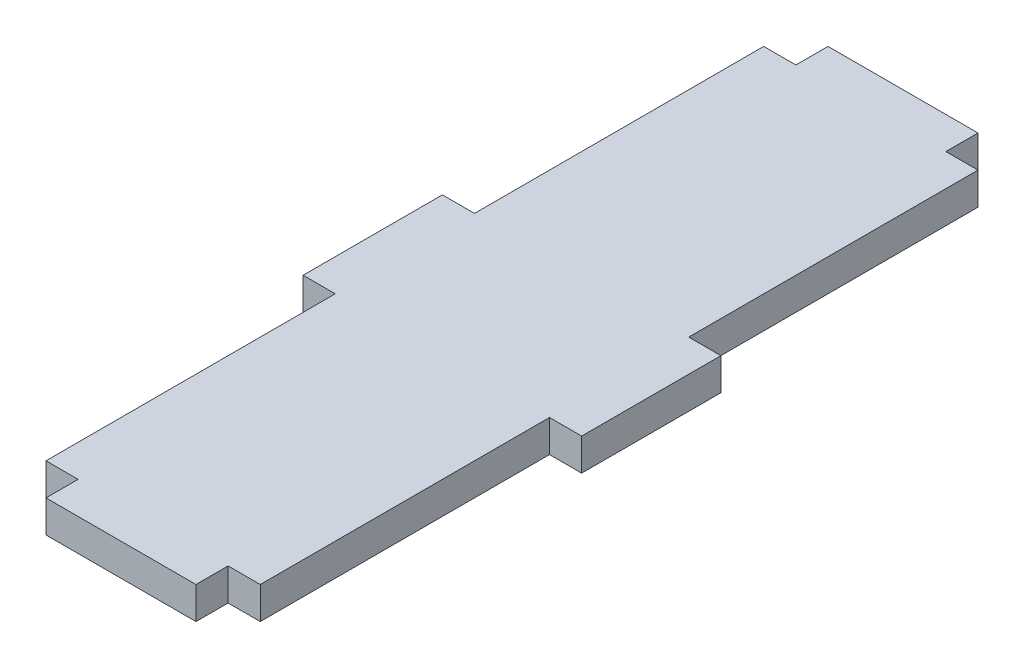
ISO-10303-21;
HEADER;
FILE_DESCRIPTION(('STEP AP214'),'2;1');
FILE_NAME('part.step','',(''),(''),'','','');
FILE_SCHEMA(('AUTOMOTIVE_DESIGN { 1 0 10303 214 1 1 1 1 }'));
ENDSEC;
DATA;
#1=APPLICATION_CONTEXT('core data for automotive mechanical design processes');
#2=APPLICATION_PROTOCOL_DEFINITION('international standard','automotive_design',2000,#1);
#3=PRODUCT_CONTEXT('',#1,'mechanical');
#4=PRODUCT('Part','Part','',(#3));
#5=PRODUCT_RELATED_PRODUCT_CATEGORY('part','',(#4));
#6=PRODUCT_DEFINITION_FORMATION('','',#4);
#7=PRODUCT_DEFINITION_CONTEXT('part definition',#1,'design');
#8=PRODUCT_DEFINITION('design','',#6,#7);
#9=PRODUCT_DEFINITION_SHAPE('','',#8);
#10=(LENGTH_UNIT() NAMED_UNIT(*) SI_UNIT(.MILLI.,.METRE.));
#11=(NAMED_UNIT(*) PLANE_ANGLE_UNIT() SI_UNIT($,.RADIAN.));
#12=(NAMED_UNIT(*) SI_UNIT($,.STERADIAN.) SOLID_ANGLE_UNIT());
#13=UNCERTAINTY_MEASURE_WITH_UNIT(LENGTH_MEASURE(1.E-05),#10,'distance_accuracy_value','');
#14=(GEOMETRIC_REPRESENTATION_CONTEXT(3) GLOBAL_UNCERTAINTY_ASSIGNED_CONTEXT((#13)) GLOBAL_UNIT_ASSIGNED_CONTEXT((#10,
#11,#12)) REPRESENTATION_CONTEXT('',''));
#15=CARTESIAN_POINT('',(0.,0.,0.));
#16=DIRECTION('',(0.,0.,1.));
#17=DIRECTION('',(1.,0.,0.));
#18=AXIS2_PLACEMENT_3D('',#15,#16,#17);
#19=CARTESIAN_POINT('',(0.,3.,-22.));
#20=DIRECTION('',(0.,0.,-1.));
#21=DIRECTION('',(-1.,0.,0.));
#22=AXIS2_PLACEMENT_3D('',#19,#20,#21);
#23=PLANE('',#22);
#24=DIRECTION('',(1.,0.,0.));
#25=VECTOR('',#24,1.);
#26=CARTESIAN_POINT('',(0.,0.,-22.));
#27=LINE('',#26,#25);
#28=CARTESIAN_POINT('',(18.5,0.,-22.));
#29=VERTEX_POINT('',#28);
#30=CARTESIAN_POINT('',(21.5,0.,-22.));
#31=VERTEX_POINT('',#30);
#32=EDGE_CURVE('E199',#29,#31,#27,.T.);
#33=ORIENTED_EDGE('',*,*,#32,.F.);
#34=DIRECTION('',(0.,-1.,0.));
#35=VECTOR('',#34,1.);
#36=CARTESIAN_POINT('',(18.5,3.,-22.));
#37=LINE('',#36,#35);
#38=CARTESIAN_POINT('',(18.5,3.,-22.));
#39=VERTEX_POINT('',#38);
#40=EDGE_CURVE('E11',#39,#29,#37,.T.);
#41=ORIENTED_EDGE('',*,*,#40,.F.);
#42=DIRECTION('',(1.,0.,0.));
#43=VECTOR('',#42,1.);
#44=CARTESIAN_POINT('',(0.,3.,-22.));
#45=LINE('',#44,#43);
#46=CARTESIAN_POINT('',(21.5,3.,-22.));
#47=VERTEX_POINT('',#46);
#48=EDGE_CURVE('E250',#39,#47,#45,.T.);
#49=ORIENTED_EDGE('',*,*,#48,.T.);
#50=DIRECTION('',(0.,-1.,0.));
#51=VECTOR('',#50,1.);
#52=CARTESIAN_POINT('',(21.5,3.,-22.));
#53=LINE('',#52,#51);
#54=EDGE_CURVE('E51',#47,#31,#53,.T.);
#55=ORIENTED_EDGE('',*,*,#54,.T.);
#56=EDGE_LOOP('',(#33,#41,#49,#55));
#57=FACE_BOUND('',#56,.T.);
#58=ADVANCED_FACE('F35',(#57),#23,.T.);
#59=CARTESIAN_POINT('',(18.5,3.,0.));
#60=DIRECTION('',(1.,0.,0.));
#61=DIRECTION('',(0.,0.,-1.));
#62=AXIS2_PLACEMENT_3D('',#59,#60,#61);
#63=PLANE('',#62);
#64=DIRECTION('',(0.,0.,1.));
#65=VECTOR('',#64,1.);
#66=CARTESIAN_POINT('',(18.5,0.,0.));
#67=LINE('',#66,#65);
#68=CARTESIAN_POINT('',(18.5,0.,-49.));
#69=VERTEX_POINT('',#68);
#70=EDGE_CURVE('E201',#69,#29,#67,.T.);
#71=ORIENTED_EDGE('',*,*,#70,.F.);
#72=DIRECTION('',(0.,-1.,0.));
#73=VECTOR('',#72,1.);
#74=CARTESIAN_POINT('',(18.5,3.,-49.));
#75=LINE('',#74,#73);
#76=CARTESIAN_POINT('',(18.5,3.,-49.));
#77=VERTEX_POINT('',#76);
#78=EDGE_CURVE('E43',#77,#69,#75,.T.);
#79=ORIENTED_EDGE('',*,*,#78,.F.);
#80=DIRECTION('',(0.,0.,1.));
#81=VECTOR('',#80,1.);
#82=CARTESIAN_POINT('',(18.5,3.,0.));
#83=LINE('',#82,#81);
#84=EDGE_CURVE('E582',#77,#39,#83,.T.);
#85=ORIENTED_EDGE('',*,*,#84,.T.);
#86=ORIENTED_EDGE('',*,*,#40,.T.);
#87=EDGE_LOOP('',(#71,#79,#85,#86));
#88=FACE_BOUND('',#87,.T.);
#89=ADVANCED_FACE('F296',(#88),#63,.T.);
#90=CARTESIAN_POINT('',(0.,3.,-49.));
#91=DIRECTION('',(0.,0.,-1.));
#92=DIRECTION('',(-1.,0.,0.));
#93=AXIS2_PLACEMENT_3D('',#90,#91,#92);
#94=PLANE('',#93);
#95=DIRECTION('',(1.,0.,0.));
#96=VECTOR('',#95,1.);
#97=CARTESIAN_POINT('',(0.,0.,-49.));
#98=LINE('',#97,#96);
#99=CARTESIAN_POINT('',(15.5,0.,-49.));
#100=VERTEX_POINT('',#99);
#101=EDGE_CURVE('E204',#100,#69,#98,.T.);
#102=ORIENTED_EDGE('',*,*,#101,.F.);
#103=DIRECTION('',(0.,-1.,0.));
#104=VECTOR('',#103,1.);
#105=CARTESIAN_POINT('',(15.5,3.,-49.));
#106=LINE('',#105,#104);
#107=CARTESIAN_POINT('',(15.5,3.,-49.));
#108=VERTEX_POINT('',#107);
#109=EDGE_CURVE('E285',#108,#100,#106,.T.);
#110=ORIENTED_EDGE('',*,*,#109,.F.);
#111=DIRECTION('',(1.,0.,0.));
#112=VECTOR('',#111,1.);
#113=CARTESIAN_POINT('',(0.,3.,-49.));
#114=LINE('',#113,#112);
#115=EDGE_CURVE('E292',#108,#77,#114,.T.);
#116=ORIENTED_EDGE('',*,*,#115,.T.);
#117=ORIENTED_EDGE('',*,*,#78,.T.);
#118=EDGE_LOOP('',(#102,#110,#116,#117));
#119=FACE_BOUND('',#118,.T.);
#120=ADVANCED_FACE('F290',(#119),#94,.T.);
#121=CARTESIAN_POINT('',(15.5,3.,0.));
#122=DIRECTION('',(-1.,0.,0.));
#123=DIRECTION('',(0.,0.,1.));
#124=AXIS2_PLACEMENT_3D('',#121,#122,#123);
#125=PLANE('',#124);
#126=DIRECTION('',(0.,0.,-1.));
#127=VECTOR('',#126,1.);
#128=CARTESIAN_POINT('',(15.5,0.,0.));
#129=LINE('',#128,#127);
#130=CARTESIAN_POINT('',(15.5,0.,-52.));
#131=VERTEX_POINT('',#130);
#132=EDGE_CURVE('E207',#100,#131,#129,.T.);
#133=ORIENTED_EDGE('',*,*,#132,.T.);
#134=DIRECTION('',(0.,-1.,0.));
#135=VECTOR('',#134,1.);
#136=CARTESIAN_POINT('',(15.5,3.,-52.));
#137=LINE('',#136,#135);
#138=CARTESIAN_POINT('',(15.5,3.,-52.));
#139=VERTEX_POINT('',#138);
#140=EDGE_CURVE('E282',#139,#131,#137,.T.);
#141=ORIENTED_EDGE('',*,*,#140,.F.);
#142=DIRECTION('',(0.,0.,-1.));
#143=VECTOR('',#142,1.);
#144=CARTESIAN_POINT('',(15.5,3.,0.));
#145=LINE('',#144,#143);
#146=EDGE_CURVE('E313',#108,#139,#145,.T.);
#147=ORIENTED_EDGE('',*,*,#146,.F.);
#148=ORIENTED_EDGE('',*,*,#109,.T.);
#149=EDGE_LOOP('',(#133,#141,#147,#148));
#150=FACE_BOUND('',#149,.T.);
#151=ADVANCED_FACE('F304',(#150),#125,.F.);
#152=CARTESIAN_POINT('',(0.,3.,-52.));
#153=DIRECTION('',(0.,0.,1.));
#154=DIRECTION('',(1.,0.,0.));
#155=AXIS2_PLACEMENT_3D('',#152,#153,#154);
#156=PLANE('',#155);
#157=DIRECTION('',(-1.,0.,0.));
#158=VECTOR('',#157,1.);
#159=CARTESIAN_POINT('',(0.,0.,-52.));
#160=LINE('',#159,#158);
#161=CARTESIAN_POINT('',(1.49999999999999,0.,-52.));
#162=VERTEX_POINT('',#161);
#163=EDGE_CURVE('E209',#131,#162,#160,.T.);
#164=ORIENTED_EDGE('',*,*,#163,.T.);
#165=DIRECTION('',(0.,-1.,0.));
#166=VECTOR('',#165,1.);
#167=CARTESIAN_POINT('',(1.49999999999999,3.,-52.));
#168=LINE('',#167,#166);
#169=CARTESIAN_POINT('',(1.49999999999999,3.,-52.));
#170=VERTEX_POINT('',#169);
#171=EDGE_CURVE('E279',#170,#162,#168,.T.);
#172=ORIENTED_EDGE('',*,*,#171,.F.);
#173=DIRECTION('',(-1.,0.,0.));
#174=VECTOR('',#173,1.);
#175=CARTESIAN_POINT('',(0.,3.,-52.));
#176=LINE('',#175,#174);
#177=EDGE_CURVE('E310',#139,#170,#176,.T.);
#178=ORIENTED_EDGE('',*,*,#177,.F.);
#179=ORIENTED_EDGE('',*,*,#140,.T.);
#180=EDGE_LOOP('',(#164,#172,#178,#179));
#181=FACE_BOUND('',#180,.T.);
#182=ADVANCED_FACE('F308',(#181),#156,.F.);
#183=CARTESIAN_POINT('',(1.49999999999999,3.,0.));
#184=DIRECTION('',(1.,0.,0.));
#185=DIRECTION('',(0.,0.,-1.));
#186=AXIS2_PLACEMENT_3D('',#183,#184,#185);
#187=PLANE('',#186);
#188=DIRECTION('',(0.,0.,1.));
#189=VECTOR('',#188,1.);
#190=CARTESIAN_POINT('',(1.49999999999999,0.,0.));
#191=LINE('',#190,#189);
#192=CARTESIAN_POINT('',(1.49999999999999,0.,-49.));
#193=VERTEX_POINT('',#192);
#194=EDGE_CURVE('E211',#162,#193,#191,.T.);
#195=ORIENTED_EDGE('',*,*,#194,.T.);
#196=DIRECTION('',(0.,-1.,0.));
#197=VECTOR('',#196,1.);
#198=CARTESIAN_POINT('',(1.49999999999999,3.,-49.));
#199=LINE('',#198,#197);
#200=CARTESIAN_POINT('',(1.49999999999999,3.,-49.));
#201=VERTEX_POINT('',#200);
#202=EDGE_CURVE('E277',#201,#193,#199,.T.);
#203=ORIENTED_EDGE('',*,*,#202,.F.);
#204=DIRECTION('',(0.,0.,1.));
#205=VECTOR('',#204,1.);
#206=CARTESIAN_POINT('',(1.49999999999999,3.,0.));
#207=LINE('',#206,#205);
#208=EDGE_CURVE('E312',#170,#201,#207,.T.);
#209=ORIENTED_EDGE('',*,*,#208,.F.);
#210=ORIENTED_EDGE('',*,*,#171,.T.);
#211=EDGE_LOOP('',(#195,#203,#209,#210));
#212=FACE_BOUND('',#211,.T.);
#213=ADVANCED_FACE('F370',(#212),#187,.F.);
#214=CARTESIAN_POINT('',(0.,3.,-49.));
#215=DIRECTION('',(0.,0.,-1.));
#216=DIRECTION('',(-1.,0.,0.));
#217=AXIS2_PLACEMENT_3D('',#214,#215,#216);
#218=PLANE('',#217);
#219=DIRECTION('',(1.,0.,0.));
#220=VECTOR('',#219,1.);
#221=CARTESIAN_POINT('',(0.,0.,-49.));
#222=LINE('',#221,#220);
#223=CARTESIAN_POINT('',(-1.5,0.,-49.));
#224=VERTEX_POINT('',#223);
#225=EDGE_CURVE('E214',#224,#193,#222,.T.);
#226=ORIENTED_EDGE('',*,*,#225,.F.);
#227=DIRECTION('',(0.,-1.,0.));
#228=VECTOR('',#227,1.);
#229=CARTESIAN_POINT('',(-1.5,3.,-49.));
#230=LINE('',#229,#228);
#231=CARTESIAN_POINT('',(-1.5,3.,-49.));
#232=VERTEX_POINT('',#231);
#233=EDGE_CURVE('E275',#232,#224,#230,.T.);
#234=ORIENTED_EDGE('',*,*,#233,.F.);
#235=DIRECTION('',(1.,0.,0.));
#236=VECTOR('',#235,1.);
#237=CARTESIAN_POINT('',(0.,3.,-49.));
#238=LINE('',#237,#236);
#239=EDGE_CURVE('E315',#232,#201,#238,.T.);
#240=ORIENTED_EDGE('',*,*,#239,.T.);
#241=ORIENTED_EDGE('',*,*,#202,.T.);
#242=EDGE_LOOP('',(#226,#234,#240,#241));
#243=FACE_BOUND('',#242,.T.);
#244=ADVANCED_FACE('F373',(#243),#218,.T.);
#245=CARTESIAN_POINT('',(-1.5,3.,0.));
#246=DIRECTION('',(1.,0.,0.));
#247=DIRECTION('',(0.,0.,-1.));
#248=AXIS2_PLACEMENT_3D('',#245,#246,#247);
#249=PLANE('',#248);
#250=DIRECTION('',(0.,0.,1.));
#251=VECTOR('',#250,1.);
#252=CARTESIAN_POINT('',(-1.5,0.,0.));
#253=LINE('',#252,#251);
#254=CARTESIAN_POINT('',(-1.5,0.,-22.));
#255=VERTEX_POINT('',#254);
#256=EDGE_CURVE('E217',#224,#255,#253,.T.);
#257=ORIENTED_EDGE('',*,*,#256,.T.);
#258=DIRECTION('',(0.,-1.,0.));
#259=VECTOR('',#258,1.);
#260=CARTESIAN_POINT('',(-1.5,3.,-22.));
#261=LINE('',#260,#259);
#262=CARTESIAN_POINT('',(-1.5,3.,-22.));
#263=VERTEX_POINT('',#262);
#264=EDGE_CURVE('E272',#263,#255,#261,.T.);
#265=ORIENTED_EDGE('',*,*,#264,.F.);
#266=DIRECTION('',(0.,0.,1.));
#267=VECTOR('',#266,1.);
#268=CARTESIAN_POINT('',(-1.5,3.,0.));
#269=LINE('',#268,#267);
#270=EDGE_CURVE('E322',#232,#263,#269,.T.);
#271=ORIENTED_EDGE('',*,*,#270,.F.);
#272=ORIENTED_EDGE('',*,*,#233,.T.);
#273=EDGE_LOOP('',(#257,#265,#271,#272));
#274=FACE_BOUND('',#273,.T.);
#275=ADVANCED_FACE('F377',(#274),#249,.F.);
#276=CARTESIAN_POINT('',(0.,3.,-22.));
#277=DIRECTION('',(0.,0.,1.));
#278=DIRECTION('',(1.,0.,0.));
#279=AXIS2_PLACEMENT_3D('',#276,#277,#278);
#280=PLANE('',#279);
#281=DIRECTION('',(-1.,0.,0.));
#282=VECTOR('',#281,1.);
#283=CARTESIAN_POINT('',(0.,0.,-22.));
#284=LINE('',#283,#282);
#285=CARTESIAN_POINT('',(-4.5,0.,-22.));
#286=VERTEX_POINT('',#285);
#287=EDGE_CURVE('E219',#255,#286,#284,.T.);
#288=ORIENTED_EDGE('',*,*,#287,.T.);
#289=DIRECTION('',(0.,-1.,0.));
#290=VECTOR('',#289,1.);
#291=CARTESIAN_POINT('',(-4.5,3.,-22.));
#292=LINE('',#291,#290);
#293=CARTESIAN_POINT('',(-4.5,3.,-22.));
#294=VERTEX_POINT('',#293);
#295=EDGE_CURVE('E269',#294,#286,#292,.T.);
#296=ORIENTED_EDGE('',*,*,#295,.F.);
#297=DIRECTION('',(-1.,0.,0.));
#298=VECTOR('',#297,1.);
#299=CARTESIAN_POINT('',(0.,3.,-22.));
#300=LINE('',#299,#298);
#301=EDGE_CURVE('E324',#263,#294,#300,.T.);
#302=ORIENTED_EDGE('',*,*,#301,.F.);
#303=ORIENTED_EDGE('',*,*,#264,.T.);
#304=EDGE_LOOP('',(#288,#296,#302,#303));
#305=FACE_BOUND('',#304,.T.);
#306=ADVANCED_FACE('F381',(#305),#280,.F.);
#307=CARTESIAN_POINT('',(-4.5,3.,0.));
#308=DIRECTION('',(1.,0.,0.));
#309=DIRECTION('',(0.,0.,-1.));
#310=AXIS2_PLACEMENT_3D('',#307,#308,#309);
#311=PLANE('',#310);
#312=DIRECTION('',(0.,0.,1.));
#313=VECTOR('',#312,1.);
#314=CARTESIAN_POINT('',(-4.5,0.,0.));
#315=LINE('',#314,#313);
#316=CARTESIAN_POINT('',(-4.5,0.,-9.));
#317=VERTEX_POINT('',#316);
#318=EDGE_CURVE('E221',#286,#317,#315,.T.);
#319=ORIENTED_EDGE('',*,*,#318,.T.);
#320=DIRECTION('',(0.,-1.,0.));
#321=VECTOR('',#320,1.);
#322=CARTESIAN_POINT('',(-4.5,3.,-9.));
#323=LINE('',#322,#321);
#324=CARTESIAN_POINT('',(-4.5,3.,-9.));
#325=VERTEX_POINT('',#324);
#326=EDGE_CURVE('E267',#325,#317,#323,.T.);
#327=ORIENTED_EDGE('',*,*,#326,.F.);
#328=DIRECTION('',(0.,0.,1.));
#329=VECTOR('',#328,1.);
#330=CARTESIAN_POINT('',(-4.5,3.,0.));
#331=LINE('',#330,#329);
#332=EDGE_CURVE('E326',#294,#325,#331,.T.);
#333=ORIENTED_EDGE('',*,*,#332,.F.);
#334=ORIENTED_EDGE('',*,*,#295,.T.);
#335=EDGE_LOOP('',(#319,#327,#333,#334));
#336=FACE_BOUND('',#335,.T.);
#337=ADVANCED_FACE('F385',(#336),#311,.F.);
#338=CARTESIAN_POINT('',(0.,3.,-9.));
#339=DIRECTION('',(0.,0.,1.));
#340=DIRECTION('',(1.,0.,0.));
#341=AXIS2_PLACEMENT_3D('',#338,#339,#340);
#342=PLANE('',#341);
#343=DIRECTION('',(-1.,0.,0.));
#344=VECTOR('',#343,1.);
#345=CARTESIAN_POINT('',(0.,0.,-9.));
#346=LINE('',#345,#344);
#347=CARTESIAN_POINT('',(-1.5,0.,-9.));
#348=VERTEX_POINT('',#347);
#349=EDGE_CURVE('E224',#348,#317,#346,.T.);
#350=ORIENTED_EDGE('',*,*,#349,.F.);
#351=DIRECTION('',(0.,-1.,0.));
#352=VECTOR('',#351,1.);
#353=CARTESIAN_POINT('',(-1.5,3.,-9.));
#354=LINE('',#353,#352);
#355=CARTESIAN_POINT('',(-1.5,3.,-9.));
#356=VERTEX_POINT('',#355);
#357=EDGE_CURVE('E265',#356,#348,#354,.T.);
#358=ORIENTED_EDGE('',*,*,#357,.F.);
#359=DIRECTION('',(-1.,0.,0.));
#360=VECTOR('',#359,1.);
#361=CARTESIAN_POINT('',(0.,3.,-9.));
#362=LINE('',#361,#360);
#363=EDGE_CURVE('E328',#356,#325,#362,.T.);
#364=ORIENTED_EDGE('',*,*,#363,.T.);
#365=ORIENTED_EDGE('',*,*,#326,.T.);
#366=EDGE_LOOP('',(#350,#358,#364,#365));
#367=FACE_BOUND('',#366,.T.);
#368=ADVANCED_FACE('F389',(#367),#342,.T.);
#369=CARTESIAN_POINT('',(-1.5,3.,0.));
#370=DIRECTION('',(-1.,0.,0.));
#371=DIRECTION('',(0.,0.,1.));
#372=AXIS2_PLACEMENT_3D('',#369,#370,#371);
#373=PLANE('',#372);
#374=DIRECTION('',(0.,0.,-1.));
#375=VECTOR('',#374,1.);
#376=CARTESIAN_POINT('',(-1.5,0.,0.));
#377=LINE('',#376,#375);
#378=CARTESIAN_POINT('',(-1.5,0.,18.));
#379=VERTEX_POINT('',#378);
#380=EDGE_CURVE('E227',#379,#348,#377,.T.);
#381=ORIENTED_EDGE('',*,*,#380,.F.);
#382=DIRECTION('',(0.,-1.,0.));
#383=VECTOR('',#382,1.);
#384=CARTESIAN_POINT('',(-1.5,3.,18.));
#385=LINE('',#384,#383);
#386=CARTESIAN_POINT('',(-1.5,3.,18.));
#387=VERTEX_POINT('',#386);
#388=EDGE_CURVE('E263',#387,#379,#385,.T.);
#389=ORIENTED_EDGE('',*,*,#388,.F.);
#390=DIRECTION('',(0.,0.,-1.));
#391=VECTOR('',#390,1.);
#392=CARTESIAN_POINT('',(-1.5,3.,0.));
#393=LINE('',#392,#391);
#394=EDGE_CURVE('E331',#387,#356,#393,.T.);
#395=ORIENTED_EDGE('',*,*,#394,.T.);
#396=ORIENTED_EDGE('',*,*,#357,.T.);
#397=EDGE_LOOP('',(#381,#389,#395,#396));
#398=FACE_BOUND('',#397,.T.);
#399=ADVANCED_FACE('F393',(#398),#373,.T.);
#400=CARTESIAN_POINT('',(0.,3.,18.));
#401=DIRECTION('',(0.,0.,-1.));
#402=DIRECTION('',(-1.,0.,0.));
#403=AXIS2_PLACEMENT_3D('',#400,#401,#402);
#404=PLANE('',#403);
#405=DIRECTION('',(1.,0.,0.));
#406=VECTOR('',#405,1.);
#407=CARTESIAN_POINT('',(0.,0.,18.));
#408=LINE('',#407,#406);
#409=CARTESIAN_POINT('',(1.5,0.,18.));
#410=VERTEX_POINT('',#409);
#411=EDGE_CURVE('E230',#379,#410,#408,.T.);
#412=ORIENTED_EDGE('',*,*,#411,.T.);
#413=DIRECTION('',(0.,-1.,0.));
#414=VECTOR('',#413,1.);
#415=CARTESIAN_POINT('',(1.5,3.,18.));
#416=LINE('',#415,#414);
#417=CARTESIAN_POINT('',(1.5,3.,18.));
#418=VERTEX_POINT('',#417);
#419=EDGE_CURVE('E260',#418,#410,#416,.T.);
#420=ORIENTED_EDGE('',*,*,#419,.F.);
#421=DIRECTION('',(1.,0.,0.));
#422=VECTOR('',#421,1.);
#423=CARTESIAN_POINT('',(0.,3.,18.));
#424=LINE('',#423,#422);
#425=EDGE_CURVE('E334',#387,#418,#424,.T.);
#426=ORIENTED_EDGE('',*,*,#425,.F.);
#427=ORIENTED_EDGE('',*,*,#388,.T.);
#428=EDGE_LOOP('',(#412,#420,#426,#427));
#429=FACE_BOUND('',#428,.T.);
#430=ADVANCED_FACE('F397',(#429),#404,.F.);
#431=CARTESIAN_POINT('',(1.5,3.,0.));
#432=DIRECTION('',(1.,0.,0.));
#433=DIRECTION('',(0.,0.,-1.));
#434=AXIS2_PLACEMENT_3D('',#431,#432,#433);
#435=PLANE('',#434);
#436=DIRECTION('',(0.,0.,1.));
#437=VECTOR('',#436,1.);
#438=CARTESIAN_POINT('',(1.5,0.,0.));
#439=LINE('',#438,#437);
#440=CARTESIAN_POINT('',(1.5,0.,21.));
#441=VERTEX_POINT('',#440);
#442=EDGE_CURVE('E232',#410,#441,#439,.T.);
#443=ORIENTED_EDGE('',*,*,#442,.T.);
#444=DIRECTION('',(0.,-1.,0.));
#445=VECTOR('',#444,1.);
#446=CARTESIAN_POINT('',(1.5,3.,21.));
#447=LINE('',#446,#445);
#448=CARTESIAN_POINT('',(1.5,3.,21.));
#449=VERTEX_POINT('',#448);
#450=EDGE_CURVE('E258',#449,#441,#447,.T.);
#451=ORIENTED_EDGE('',*,*,#450,.F.);
#452=DIRECTION('',(0.,0.,1.));
#453=VECTOR('',#452,1.);
#454=CARTESIAN_POINT('',(1.5,3.,0.));
#455=LINE('',#454,#453);
#456=EDGE_CURVE('E336',#418,#449,#455,.T.);
#457=ORIENTED_EDGE('',*,*,#456,.F.);
#458=ORIENTED_EDGE('',*,*,#419,.T.);
#459=EDGE_LOOP('',(#443,#451,#457,#458));
#460=FACE_BOUND('',#459,.T.);
#461=ADVANCED_FACE('F401',(#460),#435,.F.);
#462=CARTESIAN_POINT('',(0.,3.,21.));
#463=DIRECTION('',(0.,0.,1.));
#464=DIRECTION('',(1.,0.,0.));
#465=AXIS2_PLACEMENT_3D('',#462,#463,#464);
#466=PLANE('',#465);
#467=DIRECTION('',(-1.,0.,0.));
#468=VECTOR('',#467,1.);
#469=CARTESIAN_POINT('',(0.,0.,21.));
#470=LINE('',#469,#468);
#471=CARTESIAN_POINT('',(15.5,0.,21.));
#472=VERTEX_POINT('',#471);
#473=EDGE_CURVE('E235',#472,#441,#470,.T.);
#474=ORIENTED_EDGE('',*,*,#473,.F.);
#475=DIRECTION('',(0.,-1.,0.));
#476=VECTOR('',#475,1.);
#477=CARTESIAN_POINT('',(15.5,3.,21.));
#478=LINE('',#477,#476);
#479=CARTESIAN_POINT('',(15.5,3.,21.));
#480=VERTEX_POINT('',#479);
#481=EDGE_CURVE('E256',#480,#472,#478,.T.);
#482=ORIENTED_EDGE('',*,*,#481,.F.);
#483=DIRECTION('',(-1.,0.,0.));
#484=VECTOR('',#483,1.);
#485=CARTESIAN_POINT('',(0.,3.,21.));
#486=LINE('',#485,#484);
#487=EDGE_CURVE('E338',#480,#449,#486,.T.);
#488=ORIENTED_EDGE('',*,*,#487,.T.);
#489=ORIENTED_EDGE('',*,*,#450,.T.);
#490=EDGE_LOOP('',(#474,#482,#488,#489));
#491=FACE_BOUND('',#490,.T.);
#492=ADVANCED_FACE('F405',(#491),#466,.T.);
#493=CARTESIAN_POINT('',(15.5,3.,0.));
#494=DIRECTION('',(-1.,0.,0.));
#495=DIRECTION('',(0.,0.,1.));
#496=AXIS2_PLACEMENT_3D('',#493,#494,#495);
#497=PLANE('',#496);
#498=DIRECTION('',(0.,0.,-1.));
#499=VECTOR('',#498,1.);
#500=CARTESIAN_POINT('',(15.5,0.,0.));
#501=LINE('',#500,#499);
#502=CARTESIAN_POINT('',(15.5,0.,18.));
#503=VERTEX_POINT('',#502);
#504=EDGE_CURVE('E238',#472,#503,#501,.T.);
#505=ORIENTED_EDGE('',*,*,#504,.T.);
#506=DIRECTION('',(0.,-1.,0.));
#507=VECTOR('',#506,1.);
#508=CARTESIAN_POINT('',(15.5,3.,18.));
#509=LINE('',#508,#507);
#510=CARTESIAN_POINT('',(15.5,3.,18.));
#511=VERTEX_POINT('',#510);
#512=EDGE_CURVE('E254',#511,#503,#509,.T.);
#513=ORIENTED_EDGE('',*,*,#512,.F.);
#514=DIRECTION('',(0.,0.,-1.));
#515=VECTOR('',#514,1.);
#516=CARTESIAN_POINT('',(15.5,3.,0.));
#517=LINE('',#516,#515);
#518=EDGE_CURVE('E341',#480,#511,#517,.T.);
#519=ORIENTED_EDGE('',*,*,#518,.F.);
#520=ORIENTED_EDGE('',*,*,#481,.T.);
#521=EDGE_LOOP('',(#505,#513,#519,#520));
#522=FACE_BOUND('',#521,.T.);
#523=ADVANCED_FACE('F409',(#522),#497,.F.);
#524=CARTESIAN_POINT('',(0.,3.,18.));
#525=DIRECTION('',(0.,0.,1.));
#526=DIRECTION('',(1.,0.,0.));
#527=AXIS2_PLACEMENT_3D('',#524,#525,#526);
#528=PLANE('',#527);
#529=DIRECTION('',(-1.,0.,0.));
#530=VECTOR('',#529,1.);
#531=CARTESIAN_POINT('',(0.,0.,18.));
#532=LINE('',#531,#530);
#533=CARTESIAN_POINT('',(18.5,0.,18.));
#534=VERTEX_POINT('',#533);
#535=EDGE_CURVE('E241',#534,#503,#532,.T.);
#536=ORIENTED_EDGE('',*,*,#535,.F.);
#537=DIRECTION('',(0.,-1.,0.));
#538=VECTOR('',#537,1.);
#539=CARTESIAN_POINT('',(18.5,3.,18.));
#540=LINE('',#539,#538);
#541=CARTESIAN_POINT('',(18.5,3.,18.));
#542=VERTEX_POINT('',#541);
#543=EDGE_CURVE('E191',#542,#534,#540,.T.);
#544=ORIENTED_EDGE('',*,*,#543,.F.);
#545=DIRECTION('',(-1.,0.,0.));
#546=VECTOR('',#545,1.);
#547=CARTESIAN_POINT('',(0.,3.,18.));
#548=LINE('',#547,#546);
#549=EDGE_CURVE('E181',#542,#511,#548,.T.);
#550=ORIENTED_EDGE('',*,*,#549,.T.);
#551=ORIENTED_EDGE('',*,*,#512,.T.);
#552=EDGE_LOOP('',(#536,#544,#550,#551));
#553=FACE_BOUND('',#552,.T.);
#554=ADVANCED_FACE('F344',(#553),#528,.T.);
#555=CARTESIAN_POINT('',(18.5,3.,0.));
#556=DIRECTION('',(-1.,0.,0.));
#557=DIRECTION('',(0.,0.,1.));
#558=AXIS2_PLACEMENT_3D('',#555,#556,#557);
#559=PLANE('',#558);
#560=DIRECTION('',(0.,0.,-1.));
#561=VECTOR('',#560,1.);
#562=CARTESIAN_POINT('',(18.5,0.,0.));
#563=LINE('',#562,#561);
#564=CARTESIAN_POINT('',(18.5,0.,-9.));
#565=VERTEX_POINT('',#564);
#566=EDGE_CURVE('E188',#534,#565,#563,.T.);
#567=ORIENTED_EDGE('',*,*,#566,.T.);
#568=DIRECTION('',(0.,-1.,0.));
#569=VECTOR('',#568,1.);
#570=CARTESIAN_POINT('',(18.5,3.,-9.));
#571=LINE('',#570,#569);
#572=CARTESIAN_POINT('',(18.5,3.,-9.));
#573=VERTEX_POINT('',#572);
#574=EDGE_CURVE('E185',#573,#565,#571,.T.);
#575=ORIENTED_EDGE('',*,*,#574,.F.);
#576=DIRECTION('',(0.,0.,-1.));
#577=VECTOR('',#576,1.);
#578=CARTESIAN_POINT('',(18.5,3.,0.));
#579=LINE('',#578,#577);
#580=EDGE_CURVE('E174',#542,#573,#579,.T.);
#581=ORIENTED_EDGE('',*,*,#580,.F.);
#582=ORIENTED_EDGE('',*,*,#543,.T.);
#583=EDGE_LOOP('',(#567,#575,#581,#582));
#584=FACE_BOUND('',#583,.T.);
#585=ADVANCED_FACE('F186',(#584),#559,.F.);
#586=CARTESIAN_POINT('',(0.,3.,-9.));
#587=DIRECTION('',(0.,0.,-1.));
#588=DIRECTION('',(-1.,0.,0.));
#589=AXIS2_PLACEMENT_3D('',#586,#587,#588);
#590=PLANE('',#589);
#591=DIRECTION('',(1.,0.,0.));
#592=VECTOR('',#591,1.);
#593=CARTESIAN_POINT('',(0.,0.,-9.));
#594=LINE('',#593,#592);
#595=CARTESIAN_POINT('',(21.5,0.,-9.));
#596=VERTEX_POINT('',#595);
#597=EDGE_CURVE('E245',#565,#596,#594,.T.);
#598=ORIENTED_EDGE('',*,*,#597,.T.);
#599=DIRECTION('',(0.,-1.,0.));
#600=VECTOR('',#599,1.);
#601=CARTESIAN_POINT('',(21.5,3.,-9.));
#602=LINE('',#601,#600);
#603=CARTESIAN_POINT('',(21.5,3.,-9.));
#604=VERTEX_POINT('',#603);
#605=EDGE_CURVE('E113',#604,#596,#602,.T.);
#606=ORIENTED_EDGE('',*,*,#605,.F.);
#607=DIRECTION('',(1.,0.,0.));
#608=VECTOR('',#607,1.);
#609=CARTESIAN_POINT('',(0.,3.,-9.));
#610=LINE('',#609,#608);
#611=EDGE_CURVE('E179',#573,#604,#610,.T.);
#612=ORIENTED_EDGE('',*,*,#611,.F.);
#613=ORIENTED_EDGE('',*,*,#574,.T.);
#614=EDGE_LOOP('',(#598,#606,#612,#613));
#615=FACE_BOUND('',#614,.T.);
#616=ADVANCED_FACE('F193',(#615),#590,.F.);
#617=CARTESIAN_POINT('',(21.5,3.,0.));
#618=DIRECTION('',(1.,0.,0.));
#619=DIRECTION('',(0.,0.,-1.));
#620=AXIS2_PLACEMENT_3D('',#617,#618,#619);
#621=PLANE('',#620);
#622=DIRECTION('',(0.,0.,1.));
#623=VECTOR('',#622,1.);
#624=CARTESIAN_POINT('',(21.5,0.,0.));
#625=LINE('',#624,#623);
#626=EDGE_CURVE('E247',#31,#596,#625,.T.);
#627=ORIENTED_EDGE('',*,*,#626,.F.);
#628=ORIENTED_EDGE('',*,*,#54,.F.);
#629=DIRECTION('',(0.,0.,1.));
#630=VECTOR('',#629,1.);
#631=CARTESIAN_POINT('',(21.5,3.,0.));
#632=LINE('',#631,#630);
#633=EDGE_CURVE('E194',#47,#604,#632,.T.);
#634=ORIENTED_EDGE('',*,*,#633,.T.);
#635=ORIENTED_EDGE('',*,*,#605,.T.);
#636=EDGE_LOOP('',(#627,#628,#634,#635));
#637=FACE_BOUND('',#636,.T.);
#638=ADVANCED_FACE('F347',(#637),#621,.T.);
#639=CARTESIAN_POINT('',(0.,3.,0.));
#640=DIRECTION('',(0.,1.,0.));
#641=DIRECTION('',(0.,0.,1.));
#642=AXIS2_PLACEMENT_3D('',#639,#640,#641);
#643=PLANE('',#642);
#644=ORIENTED_EDGE('',*,*,#48,.F.);
#645=ORIENTED_EDGE('',*,*,#84,.F.);
#646=ORIENTED_EDGE('',*,*,#115,.F.);
#647=ORIENTED_EDGE('',*,*,#146,.T.);
#648=ORIENTED_EDGE('',*,*,#177,.T.);
#649=ORIENTED_EDGE('',*,*,#208,.T.);
#650=ORIENTED_EDGE('',*,*,#239,.F.);
#651=ORIENTED_EDGE('',*,*,#270,.T.);
#652=ORIENTED_EDGE('',*,*,#301,.T.);
#653=ORIENTED_EDGE('',*,*,#332,.T.);
#654=ORIENTED_EDGE('',*,*,#363,.F.);
#655=ORIENTED_EDGE('',*,*,#394,.F.);
#656=ORIENTED_EDGE('',*,*,#425,.T.);
#657=ORIENTED_EDGE('',*,*,#456,.T.);
#658=ORIENTED_EDGE('',*,*,#487,.F.);
#659=ORIENTED_EDGE('',*,*,#518,.T.);
#660=ORIENTED_EDGE('',*,*,#549,.F.);
#661=ORIENTED_EDGE('',*,*,#580,.T.);
#662=ORIENTED_EDGE('',*,*,#611,.T.);
#663=ORIENTED_EDGE('',*,*,#633,.F.);
#664=EDGE_LOOP('',(#644,#645,#646,#647,#648,#649,#650,#651,#652,#653,#654,#655,#656,#657,#658,
#659,#660,#661,#662,#663));
#665=FACE_BOUND('',#664,.T.);
#666=ADVANCED_FACE('F176',(#665),#643,.T.);
#667=CARTESIAN_POINT('',(0.,0.,0.));
#668=DIRECTION('',(0.,1.,0.));
#669=DIRECTION('',(0.,0.,1.));
#670=AXIS2_PLACEMENT_3D('',#667,#668,#669);
#671=PLANE('',#670);
#672=ORIENTED_EDGE('',*,*,#32,.T.);
#673=ORIENTED_EDGE('',*,*,#626,.T.);
#674=ORIENTED_EDGE('',*,*,#597,.F.);
#675=ORIENTED_EDGE('',*,*,#566,.F.);
#676=ORIENTED_EDGE('',*,*,#535,.T.);
#677=ORIENTED_EDGE('',*,*,#504,.F.);
#678=ORIENTED_EDGE('',*,*,#473,.T.);
#679=ORIENTED_EDGE('',*,*,#442,.F.);
#680=ORIENTED_EDGE('',*,*,#411,.F.);
#681=ORIENTED_EDGE('',*,*,#380,.T.);
#682=ORIENTED_EDGE('',*,*,#349,.T.);
#683=ORIENTED_EDGE('',*,*,#318,.F.);
#684=ORIENTED_EDGE('',*,*,#287,.F.);
#685=ORIENTED_EDGE('',*,*,#256,.F.);
#686=ORIENTED_EDGE('',*,*,#225,.T.);
#687=ORIENTED_EDGE('',*,*,#194,.F.);
#688=ORIENTED_EDGE('',*,*,#163,.F.);
#689=ORIENTED_EDGE('',*,*,#132,.F.);
#690=ORIENTED_EDGE('',*,*,#101,.T.);
#691=ORIENTED_EDGE('',*,*,#70,.T.);
#692=EDGE_LOOP('',(#672,#673,#674,#675,#676,#677,#678,#679,#680,#681,#682,#683,#684,#685,#686,
#687,#688,#689,#690,#691));
#693=FACE_BOUND('',#692,.T.);
#694=ADVANCED_FACE('F299',(#693),#671,.F.);
#695=CLOSED_SHELL('',(#58,#89,#120,#151,#182,#213,#244,#275,#306,#337,#368,#399,#430,#461,#492,
#523,#554,#585,#616,#638,#666,#694));
#696=MANIFOLD_SOLID_BREP('B2',#695);
#697=ADVANCED_BREP_SHAPE_REPRESENTATION('',(#18,#696),#14);
#698=SHAPE_DEFINITION_REPRESENTATION(#9,#697);
ENDSEC;
END-ISO-10303-21;
